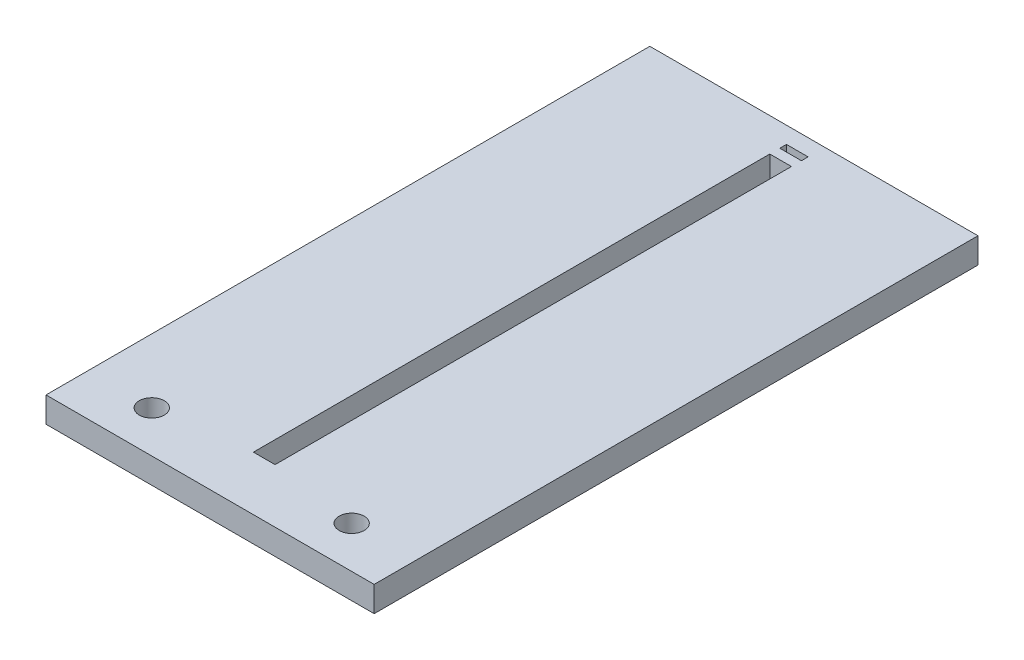
ISO-10303-21;
HEADER;
FILE_DESCRIPTION(('STEP AP214'),'2;1');
FILE_NAME('part.step','',(''),(''),'','','');
FILE_SCHEMA(('AUTOMOTIVE_DESIGN { 1 0 10303 214 1 1 1 1 }'));
ENDSEC;
DATA;
#1=APPLICATION_CONTEXT('core data for automotive mechanical design processes');
#2=APPLICATION_PROTOCOL_DEFINITION('international standard','automotive_design',2000,#1);
#3=PRODUCT_CONTEXT('',#1,'mechanical');
#4=PRODUCT('Part','Part','',(#3));
#5=PRODUCT_RELATED_PRODUCT_CATEGORY('part','',(#4));
#6=PRODUCT_DEFINITION_FORMATION('','',#4);
#7=PRODUCT_DEFINITION_CONTEXT('part definition',#1,'design');
#8=PRODUCT_DEFINITION('design','',#6,#7);
#9=PRODUCT_DEFINITION_SHAPE('','',#8);
#10=(LENGTH_UNIT() NAMED_UNIT(*) SI_UNIT(.MILLI.,.METRE.));
#11=(NAMED_UNIT(*) PLANE_ANGLE_UNIT() SI_UNIT($,.RADIAN.));
#12=(NAMED_UNIT(*) SI_UNIT($,.STERADIAN.) SOLID_ANGLE_UNIT());
#13=UNCERTAINTY_MEASURE_WITH_UNIT(LENGTH_MEASURE(1.E-05),#10,'distance_accuracy_value','');
#14=(GEOMETRIC_REPRESENTATION_CONTEXT(3) GLOBAL_UNCERTAINTY_ASSIGNED_CONTEXT((#13)) GLOBAL_UNIT_ASSIGNED_CONTEXT((#10,
#11,#12)) REPRESENTATION_CONTEXT('',''));
#15=CARTESIAN_POINT('',(0.,0.,0.));
#16=DIRECTION('',(0.,0.,1.));
#17=DIRECTION('',(1.,0.,0.));
#18=AXIS2_PLACEMENT_3D('',#15,#16,#17);
#19=CARTESIAN_POINT('',(0.,3.05,0.));
#20=DIRECTION('',(0.,1.,0.));
#21=DIRECTION('',(0.,0.,1.));
#22=AXIS2_PLACEMENT_3D('',#19,#20,#21);
#23=PLANE('',#22);
#24=CARTESIAN_POINT('',(12.,3.05,-5.));
#25=DIRECTION('',(0.,-1.,0.));
#26=DIRECTION('',(0.,0.,-1.));
#27=AXIS2_PLACEMENT_3D('',#24,#25,#26);
#28=CIRCLE('',#27,1.5);
#29=CARTESIAN_POINT('',(12.,3.05,-6.5));
#30=VERTEX_POINT('',#29);
#31=EDGE_CURVE('E507',#30,#30,#28,.T.);
#32=ORIENTED_EDGE('',*,*,#31,.T.);
#33=EDGE_LOOP('',(#32));
#34=FACE_BOUND('',#33,.T.);
#35=DIRECTION('',(1.,0.,0.));
#36=VECTOR('',#35,1.);
#37=CARTESIAN_POINT('',(0.,3.05,-6.5));
#38=LINE('',#37,#36);
#39=CARTESIAN_POINT('',(-1.30000000000001,3.05,-6.5));
#40=VERTEX_POINT('',#39);
#41=CARTESIAN_POINT('',(1.30000000000001,3.05,-6.5));
#42=VERTEX_POINT('',#41);
#43=EDGE_CURVE('E85',#40,#42,#38,.T.);
#44=ORIENTED_EDGE('',*,*,#43,.F.);
#45=DIRECTION('',(0.,0.,1.));
#46=VECTOR('',#45,1.);
#47=CARTESIAN_POINT('',(-1.30000000000001,3.05,0.));
#48=LINE('',#47,#46);
#49=CARTESIAN_POINT('',(-1.30000000000001,3.05,-68.5));
#50=VERTEX_POINT('',#49);
#51=EDGE_CURVE('E183',#50,#40,#48,.T.);
#52=ORIENTED_EDGE('',*,*,#51,.F.);
#53=DIRECTION('',(-1.,0.,0.));
#54=VECTOR('',#53,1.);
#55=CARTESIAN_POINT('',(0.,3.05,-68.5));
#56=LINE('',#55,#54);
#57=CARTESIAN_POINT('',(1.30000000000001,3.05,-68.5));
#58=VERTEX_POINT('',#57);
#59=EDGE_CURVE('E187',#58,#50,#56,.T.);
#60=ORIENTED_EDGE('',*,*,#59,.F.);
#61=DIRECTION('',(0.,0.,-1.));
#62=VECTOR('',#61,1.);
#63=CARTESIAN_POINT('',(1.30000000000001,3.05,0.));
#64=LINE('',#63,#62);
#65=EDGE_CURVE('E199',#42,#58,#64,.T.);
#66=ORIENTED_EDGE('',*,*,#65,.F.);
#67=EDGE_LOOP('',(#44,#52,#60,#66));
#68=FACE_BOUND('',#67,.T.);
#69=DIRECTION('',(0.,0.,-1.));
#70=VECTOR('',#69,1.);
#71=CARTESIAN_POINT('',(1.30000000000001,3.05,0.));
#72=LINE('',#71,#70);
#73=CARTESIAN_POINT('',(1.30000000000001,3.05,-69.7));
#74=VERTEX_POINT('',#73);
#75=CARTESIAN_POINT('',(1.30000000000001,3.05,-70.5));
#76=VERTEX_POINT('',#75);
#77=EDGE_CURVE('E236',#74,#76,#72,.T.);
#78=ORIENTED_EDGE('',*,*,#77,.F.);
#79=DIRECTION('',(1.,0.,0.));
#80=VECTOR('',#79,1.);
#81=CARTESIAN_POINT('',(0.,3.05,-69.7));
#82=LINE('',#81,#80);
#83=CARTESIAN_POINT('',(-1.30000000000001,3.05,-69.7));
#84=VERTEX_POINT('',#83);
#85=EDGE_CURVE('E200',#84,#74,#82,.T.);
#86=ORIENTED_EDGE('',*,*,#85,.F.);
#87=DIRECTION('',(0.,0.,1.));
#88=VECTOR('',#87,1.);
#89=CARTESIAN_POINT('',(-1.30000000000001,3.05,0.));
#90=LINE('',#89,#88);
#91=CARTESIAN_POINT('',(-1.30000000000001,3.05,-70.5));
#92=VERTEX_POINT('',#91);
#93=EDGE_CURVE('E93',#92,#84,#90,.T.);
#94=ORIENTED_EDGE('',*,*,#93,.F.);
#95=DIRECTION('',(-1.,0.,0.));
#96=VECTOR('',#95,1.);
#97=CARTESIAN_POINT('',(0.,3.05,-70.5));
#98=LINE('',#97,#96);
#99=EDGE_CURVE('E231',#76,#92,#98,.T.);
#100=ORIENTED_EDGE('',*,*,#99,.F.);
#101=EDGE_LOOP('',(#78,#86,#94,#100));
#102=FACE_BOUND('',#101,.T.);
#103=DIRECTION('',(1.,0.,0.));
#104=VECTOR('',#103,1.);
#105=CARTESIAN_POINT('',(0.,3.05,0.));
#106=LINE('',#105,#104);
#107=CARTESIAN_POINT('',(-19.7,3.05,0.));
#108=VERTEX_POINT('',#107);
#109=CARTESIAN_POINT('',(19.7,3.05,0.));
#110=VERTEX_POINT('',#109);
#111=EDGE_CURVE('E257',#108,#110,#106,.T.);
#112=ORIENTED_EDGE('',*,*,#111,.T.);
#113=DIRECTION('',(0.,0.,-1.));
#114=VECTOR('',#113,1.);
#115=CARTESIAN_POINT('',(19.7,3.05,0.));
#116=LINE('',#115,#114);
#117=CARTESIAN_POINT('',(19.7,3.05,-72.5));
#118=VERTEX_POINT('',#117);
#119=EDGE_CURVE('E261',#110,#118,#116,.T.);
#120=ORIENTED_EDGE('',*,*,#119,.T.);
#121=DIRECTION('',(1.,0.,0.));
#122=VECTOR('',#121,1.);
#123=CARTESIAN_POINT('',(0.,3.05,-72.5));
#124=LINE('',#123,#122);
#125=CARTESIAN_POINT('',(-19.7,3.05,-72.5));
#126=VERTEX_POINT('',#125);
#127=EDGE_CURVE('E265',#126,#118,#124,.T.);
#128=ORIENTED_EDGE('',*,*,#127,.F.);
#129=DIRECTION('',(0.,0.,-1.));
#130=VECTOR('',#129,1.);
#131=CARTESIAN_POINT('',(-19.7,3.05,0.));
#132=LINE('',#131,#130);
#133=EDGE_CURVE('E269',#108,#126,#132,.T.);
#134=ORIENTED_EDGE('',*,*,#133,.F.);
#135=EDGE_LOOP('',(#112,#120,#128,#134));
#136=FACE_BOUND('',#135,.T.);
#137=CARTESIAN_POINT('',(-12.,3.05,-5.));
#138=DIRECTION('',(0.,1.,0.));
#139=DIRECTION('',(0.,0.,1.));
#140=AXIS2_PLACEMENT_3D('',#137,#138,#139);
#141=CIRCLE('',#140,1.5);
#142=CARTESIAN_POINT('',(-12.,3.05,-3.5));
#143=VERTEX_POINT('',#142);
#144=EDGE_CURVE('E505',#143,#143,#141,.T.);
#145=ORIENTED_EDGE('',*,*,#144,.F.);
#146=EDGE_LOOP('',(#145));
#147=FACE_BOUND('',#146,.T.);
#148=ADVANCED_FACE('F69',(#34,#68,#102,#136,#147),#23,.T.);
#149=CARTESIAN_POINT('',(0.,0.,0.));
#150=DIRECTION('',(0.,1.,0.));
#151=DIRECTION('',(0.,0.,1.));
#152=AXIS2_PLACEMENT_3D('',#149,#150,#151);
#153=PLANE('',#152);
#154=DIRECTION('',(1.,0.,0.));
#155=VECTOR('',#154,1.);
#156=CARTESIAN_POINT('',(0.,0.,0.));
#157=LINE('',#156,#155);
#158=CARTESIAN_POINT('',(-19.7,0.,0.));
#159=VERTEX_POINT('',#158);
#160=CARTESIAN_POINT('',(19.7,0.,0.));
#161=VERTEX_POINT('',#160);
#162=EDGE_CURVE('E209',#159,#161,#157,.T.);
#163=ORIENTED_EDGE('',*,*,#162,.F.);
#164=DIRECTION('',(0.,0.,-1.));
#165=VECTOR('',#164,1.);
#166=CARTESIAN_POINT('',(-19.7,0.,0.));
#167=LINE('',#166,#165);
#168=CARTESIAN_POINT('',(-19.7,0.,-72.5));
#169=VERTEX_POINT('',#168);
#170=EDGE_CURVE('E262',#159,#169,#167,.T.);
#171=ORIENTED_EDGE('',*,*,#170,.T.);
#172=DIRECTION('',(1.,0.,0.));
#173=VECTOR('',#172,1.);
#174=CARTESIAN_POINT('',(0.,0.,-72.5));
#175=LINE('',#174,#173);
#176=CARTESIAN_POINT('',(19.7,0.,-72.5));
#177=VERTEX_POINT('',#176);
#178=EDGE_CURVE('E281',#169,#177,#175,.T.);
#179=ORIENTED_EDGE('',*,*,#178,.T.);
#180=DIRECTION('',(0.,0.,-1.));
#181=VECTOR('',#180,1.);
#182=CARTESIAN_POINT('',(19.7,0.,0.));
#183=LINE('',#182,#181);
#184=EDGE_CURVE('E277',#161,#177,#183,.T.);
#185=ORIENTED_EDGE('',*,*,#184,.F.);
#186=EDGE_LOOP('',(#163,#171,#179,#185));
#187=FACE_BOUND('',#186,.T.);
#188=DIRECTION('',(1.,0.,0.));
#189=VECTOR('',#188,1.);
#190=CARTESIAN_POINT('',(0.,0.,-69.7));
#191=LINE('',#190,#189);
#192=CARTESIAN_POINT('',(-1.30000000000001,0.,-69.7));
#193=VERTEX_POINT('',#192);
#194=CARTESIAN_POINT('',(1.30000000000001,0.,-69.7));
#195=VERTEX_POINT('',#194);
#196=EDGE_CURVE('E232',#193,#195,#191,.T.);
#197=ORIENTED_EDGE('',*,*,#196,.T.);
#198=DIRECTION('',(0.,0.,-1.));
#199=VECTOR('',#198,1.);
#200=CARTESIAN_POINT('',(1.30000000000001,0.,0.));
#201=LINE('',#200,#199);
#202=CARTESIAN_POINT('',(1.30000000000001,0.,-70.5));
#203=VERTEX_POINT('',#202);
#204=EDGE_CURVE('E250',#195,#203,#201,.T.);
#205=ORIENTED_EDGE('',*,*,#204,.T.);
#206=DIRECTION('',(-1.,0.,0.));
#207=VECTOR('',#206,1.);
#208=CARTESIAN_POINT('',(0.,0.,-70.5));
#209=LINE('',#208,#207);
#210=CARTESIAN_POINT('',(-1.30000000000001,0.,-70.5));
#211=VERTEX_POINT('',#210);
#212=EDGE_CURVE('E246',#203,#211,#209,.T.);
#213=ORIENTED_EDGE('',*,*,#212,.T.);
#214=DIRECTION('',(0.,0.,1.));
#215=VECTOR('',#214,1.);
#216=CARTESIAN_POINT('',(-1.30000000000001,0.,0.));
#217=LINE('',#216,#215);
#218=EDGE_CURVE('E218',#211,#193,#217,.T.);
#219=ORIENTED_EDGE('',*,*,#218,.T.);
#220=EDGE_LOOP('',(#197,#205,#213,#219));
#221=FACE_BOUND('',#220,.T.);
#222=DIRECTION('',(0.,0.,1.));
#223=VECTOR('',#222,1.);
#224=CARTESIAN_POINT('',(-1.30000000000001,0.,0.));
#225=LINE('',#224,#223);
#226=CARTESIAN_POINT('',(-1.30000000000001,0.,-68.5));
#227=VERTEX_POINT('',#226);
#228=CARTESIAN_POINT('',(-1.30000000000001,0.,-6.5));
#229=VERTEX_POINT('',#228);
#230=EDGE_CURVE('E168',#227,#229,#225,.T.);
#231=ORIENTED_EDGE('',*,*,#230,.T.);
#232=DIRECTION('',(1.,0.,0.));
#233=VECTOR('',#232,1.);
#234=CARTESIAN_POINT('',(0.,0.,-6.5));
#235=LINE('',#234,#233);
#236=CARTESIAN_POINT('',(1.30000000000001,0.,-6.5));
#237=VERTEX_POINT('',#236);
#238=EDGE_CURVE('E161',#229,#237,#235,.T.);
#239=ORIENTED_EDGE('',*,*,#238,.T.);
#240=DIRECTION('',(0.,0.,-1.));
#241=VECTOR('',#240,1.);
#242=CARTESIAN_POINT('',(1.30000000000001,0.,0.));
#243=LINE('',#242,#241);
#244=CARTESIAN_POINT('',(1.30000000000001,0.,-68.5));
#245=VERTEX_POINT('',#244);
#246=EDGE_CURVE('E172',#237,#245,#243,.T.);
#247=ORIENTED_EDGE('',*,*,#246,.T.);
#248=DIRECTION('',(-1.,0.,0.));
#249=VECTOR('',#248,1.);
#250=CARTESIAN_POINT('',(0.,0.,-68.5));
#251=LINE('',#250,#249);
#252=EDGE_CURVE('E177',#245,#227,#251,.T.);
#253=ORIENTED_EDGE('',*,*,#252,.T.);
#254=EDGE_LOOP('',(#231,#239,#247,#253));
#255=FACE_BOUND('',#254,.T.);
#256=CARTESIAN_POINT('',(12.,0.,-5.));
#257=DIRECTION('',(0.,-1.,0.));
#258=DIRECTION('',(0.,0.,-1.));
#259=AXIS2_PLACEMENT_3D('',#256,#257,#258);
#260=CIRCLE('',#259,1.5);
#261=CARTESIAN_POINT('',(12.,0.,-6.5));
#262=VERTEX_POINT('',#261);
#263=EDGE_CURVE('E190',#262,#262,#260,.T.);
#264=ORIENTED_EDGE('',*,*,#263,.F.);
#265=EDGE_LOOP('',(#264));
#266=FACE_BOUND('',#265,.T.);
#267=CARTESIAN_POINT('',(-12.,0.,-5.));
#268=DIRECTION('',(0.,1.,0.));
#269=DIRECTION('',(0.,0.,1.));
#270=AXIS2_PLACEMENT_3D('',#267,#268,#269);
#271=CIRCLE('',#270,1.5);
#272=CARTESIAN_POINT('',(-12.,0.,-3.5));
#273=VERTEX_POINT('',#272);
#274=EDGE_CURVE('E228',#273,#273,#271,.T.);
#275=ORIENTED_EDGE('',*,*,#274,.T.);
#276=EDGE_LOOP('',(#275));
#277=FACE_BOUND('',#276,.T.);
#278=ADVANCED_FACE('F179',(#187,#221,#255,#266,#277),#153,.F.);
#279=CARTESIAN_POINT('',(0.,3.05,0.));
#280=DIRECTION('',(0.,0.,-1.));
#281=DIRECTION('',(-1.,0.,0.));
#282=AXIS2_PLACEMENT_3D('',#279,#280,#281);
#283=PLANE('',#282);
#284=ORIENTED_EDGE('',*,*,#162,.T.);
#285=DIRECTION('',(0.,-1.,0.));
#286=VECTOR('',#285,1.);
#287=CARTESIAN_POINT('',(19.7,3.05,0.));
#288=LINE('',#287,#286);
#289=EDGE_CURVE('E12',#110,#161,#288,.T.);
#290=ORIENTED_EDGE('',*,*,#289,.F.);
#291=ORIENTED_EDGE('',*,*,#111,.F.);
#292=DIRECTION('',(0.,-1.,0.));
#293=VECTOR('',#292,1.);
#294=CARTESIAN_POINT('',(-19.7,3.05,0.));
#295=LINE('',#294,#293);
#296=EDGE_CURVE('E273',#108,#159,#295,.T.);
#297=ORIENTED_EDGE('',*,*,#296,.T.);
#298=EDGE_LOOP('',(#284,#290,#291,#297));
#299=FACE_BOUND('',#298,.T.);
#300=ADVANCED_FACE('F71',(#299),#283,.F.);
#301=CARTESIAN_POINT('',(19.7,3.05,0.));
#302=DIRECTION('',(-1.,0.,0.));
#303=DIRECTION('',(0.,0.,1.));
#304=AXIS2_PLACEMENT_3D('',#301,#302,#303);
#305=PLANE('',#304);
#306=ORIENTED_EDGE('',*,*,#184,.T.);
#307=DIRECTION('',(0.,-1.,0.));
#308=VECTOR('',#307,1.);
#309=CARTESIAN_POINT('',(19.7,3.05,-72.5));
#310=LINE('',#309,#308);
#311=EDGE_CURVE('E78',#118,#177,#310,.T.);
#312=ORIENTED_EDGE('',*,*,#311,.F.);
#313=ORIENTED_EDGE('',*,*,#119,.F.);
#314=ORIENTED_EDGE('',*,*,#289,.T.);
#315=EDGE_LOOP('',(#306,#312,#313,#314));
#316=FACE_BOUND('',#315,.T.);
#317=ADVANCED_FACE('F299',(#316),#305,.F.);
#318=CARTESIAN_POINT('',(0.,3.05,-72.5));
#319=DIRECTION('',(0.,0.,-1.));
#320=DIRECTION('',(-1.,0.,0.));
#321=AXIS2_PLACEMENT_3D('',#318,#319,#320);
#322=PLANE('',#321);
#323=ORIENTED_EDGE('',*,*,#178,.F.);
#324=DIRECTION('',(0.,-1.,0.));
#325=VECTOR('',#324,1.);
#326=CARTESIAN_POINT('',(-19.7,3.05,-72.5));
#327=LINE('',#326,#325);
#328=EDGE_CURVE('E290',#126,#169,#327,.T.);
#329=ORIENTED_EDGE('',*,*,#328,.F.);
#330=ORIENTED_EDGE('',*,*,#127,.T.);
#331=ORIENTED_EDGE('',*,*,#311,.T.);
#332=EDGE_LOOP('',(#323,#329,#330,#331));
#333=FACE_BOUND('',#332,.T.);
#334=ADVANCED_FACE('F296',(#333),#322,.T.);
#335=CARTESIAN_POINT('',(-19.7,3.05,0.));
#336=DIRECTION('',(-1.,0.,0.));
#337=DIRECTION('',(0.,0.,1.));
#338=AXIS2_PLACEMENT_3D('',#335,#336,#337);
#339=PLANE('',#338);
#340=ORIENTED_EDGE('',*,*,#170,.F.);
#341=ORIENTED_EDGE('',*,*,#296,.F.);
#342=ORIENTED_EDGE('',*,*,#133,.T.);
#343=ORIENTED_EDGE('',*,*,#328,.T.);
#344=EDGE_LOOP('',(#340,#341,#342,#343));
#345=FACE_BOUND('',#344,.T.);
#346=ADVANCED_FACE('F306',(#345),#339,.T.);
#347=CARTESIAN_POINT('',(1.30000000000001,0.,0.));
#348=DIRECTION('',(1.,0.,0.));
#349=DIRECTION('',(0.,0.,-1.));
#350=AXIS2_PLACEMENT_3D('',#347,#348,#349);
#351=PLANE('',#350);
#352=ORIENTED_EDGE('',*,*,#77,.T.);
#353=DIRECTION('',(0.,1.,0.));
#354=VECTOR('',#353,1.);
#355=CARTESIAN_POINT('',(1.30000000000001,0.,-70.5));
#356=LINE('',#355,#354);
#357=EDGE_CURVE('E219',#203,#76,#356,.T.);
#358=ORIENTED_EDGE('',*,*,#357,.F.);
#359=ORIENTED_EDGE('',*,*,#204,.F.);
#360=DIRECTION('',(0.,1.,0.));
#361=VECTOR('',#360,1.);
#362=CARTESIAN_POINT('',(1.30000000000001,0.,-69.7));
#363=LINE('',#362,#361);
#364=EDGE_CURVE('E215',#195,#74,#363,.T.);
#365=ORIENTED_EDGE('',*,*,#364,.T.);
#366=EDGE_LOOP('',(#352,#358,#359,#365));
#367=FACE_BOUND('',#366,.T.);
#368=ADVANCED_FACE('F331',(#367),#351,.F.);
#369=CARTESIAN_POINT('',(0.,0.,-70.5));
#370=DIRECTION('',(0.,0.,-1.));
#371=DIRECTION('',(-1.,0.,0.));
#372=AXIS2_PLACEMENT_3D('',#369,#370,#371);
#373=PLANE('',#372);
#374=ORIENTED_EDGE('',*,*,#99,.T.);
#375=DIRECTION('',(0.,1.,0.));
#376=VECTOR('',#375,1.);
#377=CARTESIAN_POINT('',(-1.30000000000001,0.,-70.5));
#378=LINE('',#377,#376);
#379=EDGE_CURVE('E222',#211,#92,#378,.T.);
#380=ORIENTED_EDGE('',*,*,#379,.F.);
#381=ORIENTED_EDGE('',*,*,#212,.F.);
#382=ORIENTED_EDGE('',*,*,#357,.T.);
#383=EDGE_LOOP('',(#374,#380,#381,#382));
#384=FACE_BOUND('',#383,.T.);
#385=ADVANCED_FACE('F347',(#384),#373,.F.);
#386=CARTESIAN_POINT('',(-1.30000000000001,0.,0.));
#387=DIRECTION('',(-1.,0.,0.));
#388=DIRECTION('',(0.,0.,1.));
#389=AXIS2_PLACEMENT_3D('',#386,#387,#388);
#390=PLANE('',#389);
#391=ORIENTED_EDGE('',*,*,#93,.T.);
#392=DIRECTION('',(0.,1.,0.));
#393=VECTOR('',#392,1.);
#394=CARTESIAN_POINT('',(-1.30000000000001,0.,-69.7));
#395=LINE('',#394,#393);
#396=EDGE_CURVE('E225',#193,#84,#395,.T.);
#397=ORIENTED_EDGE('',*,*,#396,.F.);
#398=ORIENTED_EDGE('',*,*,#218,.F.);
#399=ORIENTED_EDGE('',*,*,#379,.T.);
#400=EDGE_LOOP('',(#391,#397,#398,#399));
#401=FACE_BOUND('',#400,.T.);
#402=ADVANCED_FACE('F326',(#401),#390,.F.);
#403=CARTESIAN_POINT('',(0.,0.,-69.7));
#404=DIRECTION('',(0.,0.,1.));
#405=DIRECTION('',(1.,0.,0.));
#406=AXIS2_PLACEMENT_3D('',#403,#404,#405);
#407=PLANE('',#406);
#408=ORIENTED_EDGE('',*,*,#85,.T.);
#409=ORIENTED_EDGE('',*,*,#364,.F.);
#410=ORIENTED_EDGE('',*,*,#196,.F.);
#411=ORIENTED_EDGE('',*,*,#396,.T.);
#412=EDGE_LOOP('',(#408,#409,#410,#411));
#413=FACE_BOUND('',#412,.T.);
#414=ADVANCED_FACE('F361',(#413),#407,.F.);
#415=CARTESIAN_POINT('',(0.,0.,-6.5));
#416=DIRECTION('',(0.,0.,1.));
#417=DIRECTION('',(1.,0.,0.));
#418=AXIS2_PLACEMENT_3D('',#415,#416,#417);
#419=PLANE('',#418);
#420=ORIENTED_EDGE('',*,*,#43,.T.);
#421=DIRECTION('',(0.,1.,0.));
#422=VECTOR('',#421,1.);
#423=CARTESIAN_POINT('',(1.30000000000001,0.,-6.5));
#424=LINE('',#423,#422);
#425=EDGE_CURVE('E157',#237,#42,#424,.T.);
#426=ORIENTED_EDGE('',*,*,#425,.F.);
#427=ORIENTED_EDGE('',*,*,#238,.F.);
#428=DIRECTION('',(0.,1.,0.));
#429=VECTOR('',#428,1.);
#430=CARTESIAN_POINT('',(-1.30000000000001,0.,-6.5));
#431=LINE('',#430,#429);
#432=EDGE_CURVE('E206',#229,#40,#431,.T.);
#433=ORIENTED_EDGE('',*,*,#432,.T.);
#434=EDGE_LOOP('',(#420,#426,#427,#433));
#435=FACE_BOUND('',#434,.T.);
#436=ADVANCED_FACE('F159',(#435),#419,.F.);
#437=CARTESIAN_POINT('',(-1.30000000000001,0.,0.));
#438=DIRECTION('',(-1.,0.,0.));
#439=DIRECTION('',(0.,0.,1.));
#440=AXIS2_PLACEMENT_3D('',#437,#438,#439);
#441=PLANE('',#440);
#442=ORIENTED_EDGE('',*,*,#51,.T.);
#443=ORIENTED_EDGE('',*,*,#432,.F.);
#444=ORIENTED_EDGE('',*,*,#230,.F.);
#445=DIRECTION('',(0.,1.,0.));
#446=VECTOR('',#445,1.);
#447=CARTESIAN_POINT('',(-1.30000000000001,0.,-68.5));
#448=LINE('',#447,#446);
#449=EDGE_CURVE('E210',#227,#50,#448,.T.);
#450=ORIENTED_EDGE('',*,*,#449,.T.);
#451=EDGE_LOOP('',(#442,#443,#444,#450));
#452=FACE_BOUND('',#451,.T.);
#453=ADVANCED_FACE('F374',(#452),#441,.F.);
#454=CARTESIAN_POINT('',(0.,0.,-68.5));
#455=DIRECTION('',(0.,0.,-1.));
#456=DIRECTION('',(-1.,0.,0.));
#457=AXIS2_PLACEMENT_3D('',#454,#455,#456);
#458=PLANE('',#457);
#459=ORIENTED_EDGE('',*,*,#59,.T.);
#460=ORIENTED_EDGE('',*,*,#449,.F.);
#461=ORIENTED_EDGE('',*,*,#252,.F.);
#462=DIRECTION('',(0.,1.,0.));
#463=VECTOR('',#462,1.);
#464=CARTESIAN_POINT('',(1.30000000000001,0.,-68.5));
#465=LINE('',#464,#463);
#466=EDGE_CURVE('E167',#245,#58,#465,.T.);
#467=ORIENTED_EDGE('',*,*,#466,.T.);
#468=EDGE_LOOP('',(#459,#460,#461,#467));
#469=FACE_BOUND('',#468,.T.);
#470=ADVANCED_FACE('F381',(#469),#458,.F.);
#471=CARTESIAN_POINT('',(1.30000000000001,0.,0.));
#472=DIRECTION('',(1.,0.,0.));
#473=DIRECTION('',(0.,0.,-1.));
#474=AXIS2_PLACEMENT_3D('',#471,#472,#473);
#475=PLANE('',#474);
#476=ORIENTED_EDGE('',*,*,#65,.T.);
#477=ORIENTED_EDGE('',*,*,#466,.F.);
#478=ORIENTED_EDGE('',*,*,#246,.F.);
#479=ORIENTED_EDGE('',*,*,#425,.T.);
#480=EDGE_LOOP('',(#476,#477,#478,#479));
#481=FACE_BOUND('',#480,.T.);
#482=ADVANCED_FACE('F173',(#481),#475,.F.);
#483=CARTESIAN_POINT('',(12.,0.,-5.));
#484=DIRECTION('',(0.,1.,0.));
#485=DIRECTION('',(0.,0.,1.));
#486=AXIS2_PLACEMENT_3D('',#483,#484,#485);
#487=CYLINDRICAL_SURFACE('',#486,1.5);
#488=ORIENTED_EDGE('',*,*,#263,.T.);
#489=EDGE_LOOP('',(#488));
#490=FACE_BOUND('',#489,.T.);
#491=ORIENTED_EDGE('',*,*,#31,.F.);
#492=EDGE_LOOP('',(#491));
#493=FACE_BOUND('',#492,.T.);
#494=ADVANCED_FACE('F396',(#490,#493),#487,.F.);
#495=CARTESIAN_POINT('',(-12.,0.,-5.));
#496=DIRECTION('',(0.,1.,0.));
#497=DIRECTION('',(0.,0.,1.));
#498=AXIS2_PLACEMENT_3D('',#495,#496,#497);
#499=CYLINDRICAL_SURFACE('',#498,1.5);
#500=ORIENTED_EDGE('',*,*,#274,.F.);
#501=EDGE_LOOP('',(#500));
#502=FACE_BOUND('',#501,.T.);
#503=ORIENTED_EDGE('',*,*,#144,.T.);
#504=EDGE_LOOP('',(#503));
#505=FACE_BOUND('',#504,.T.);
#506=ADVANCED_FACE('F403',(#502,#505),#499,.F.);
#507=CLOSED_SHELL('',(#148,#278,#300,#317,#334,#346,#368,#385,#402,#414,#436,#453,#470,#482,
#494,#506));
#508=MANIFOLD_SOLID_BREP('B2',#507);
#509=ADVANCED_BREP_SHAPE_REPRESENTATION('',(#18,#508),#14);
#510=SHAPE_DEFINITION_REPRESENTATION(#9,#509);
ENDSEC;
END-ISO-10303-21;
